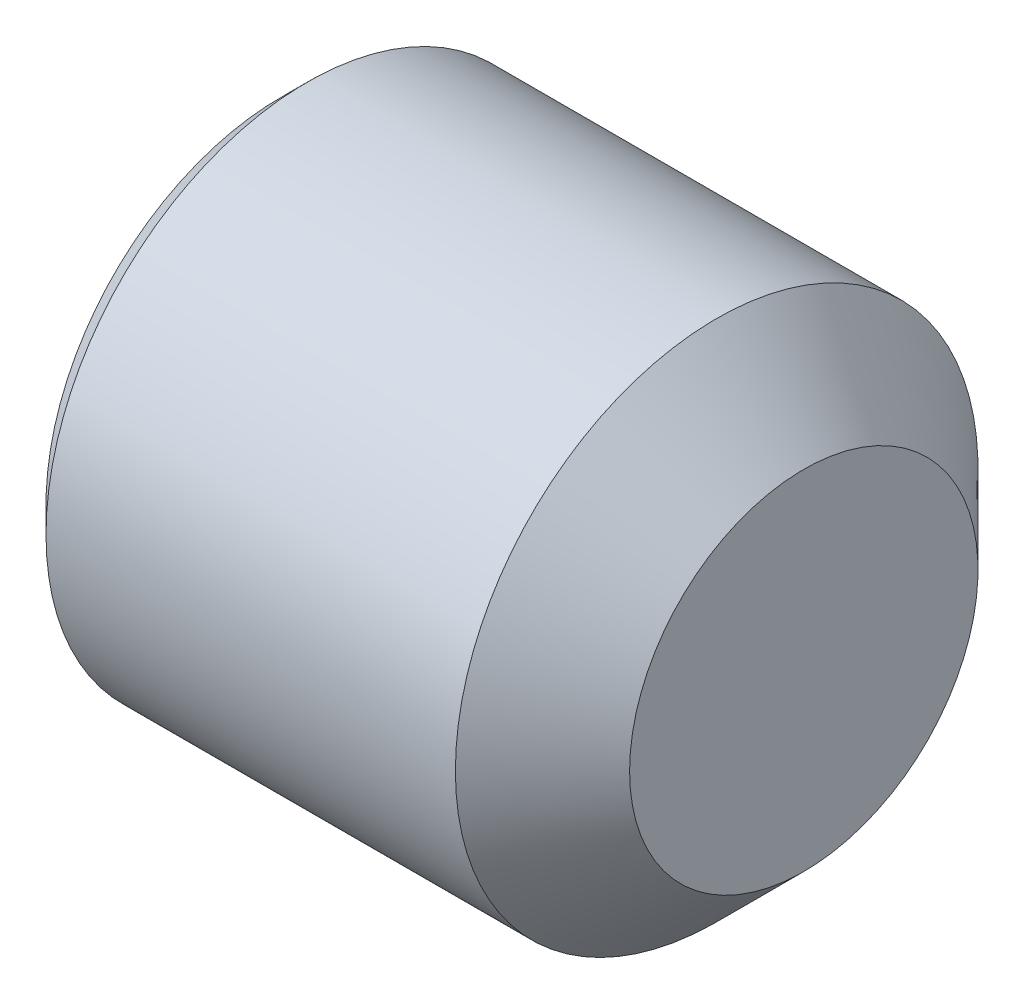
ISO-10303-21;
HEADER;
FILE_DESCRIPTION(('STEP AP214'),'2;1');
FILE_NAME('part.step','',(''),(''),'','','');
FILE_SCHEMA(('AUTOMOTIVE_DESIGN { 1 0 10303 214 1 1 1 1 }'));
ENDSEC;
DATA;
#1=APPLICATION_CONTEXT('core data for automotive mechanical design processes');
#2=APPLICATION_PROTOCOL_DEFINITION('international standard','automotive_design',2000,#1);
#3=PRODUCT_CONTEXT('',#1,'mechanical');
#4=PRODUCT('Part','Part','',(#3));
#5=PRODUCT_RELATED_PRODUCT_CATEGORY('part','',(#4));
#6=PRODUCT_DEFINITION_FORMATION('','',#4);
#7=PRODUCT_DEFINITION_CONTEXT('part definition',#1,'design');
#8=PRODUCT_DEFINITION('design','',#6,#7);
#9=PRODUCT_DEFINITION_SHAPE('','',#8);
#10=(LENGTH_UNIT() NAMED_UNIT(*) SI_UNIT(.MILLI.,.METRE.));
#11=(NAMED_UNIT(*) PLANE_ANGLE_UNIT() SI_UNIT($,.RADIAN.));
#12=(NAMED_UNIT(*) SI_UNIT($,.STERADIAN.) SOLID_ANGLE_UNIT());
#13=UNCERTAINTY_MEASURE_WITH_UNIT(LENGTH_MEASURE(1.E-05),#10,'distance_accuracy_value','');
#14=(GEOMETRIC_REPRESENTATION_CONTEXT(3) GLOBAL_UNCERTAINTY_ASSIGNED_CONTEXT((#13)) GLOBAL_UNIT_ASSIGNED_CONTEXT((#10,
#11,#12)) REPRESENTATION_CONTEXT('',''));
#15=CARTESIAN_POINT('',(0.,0.,0.));
#16=DIRECTION('',(0.,0.,1.));
#17=DIRECTION('',(1.,0.,0.));
#18=AXIS2_PLACEMENT_3D('',#15,#16,#17);
#19=CARTESIAN_POINT('',(2.,0.,0.));
#20=DIRECTION('',(1.,0.,0.));
#21=DIRECTION('',(0.,0.,-1.));
#22=AXIS2_PLACEMENT_3D('',#19,#20,#21);
#23=PLANE('',#22);
#24=CARTESIAN_POINT('',(2.,0.,0.));
#25=DIRECTION('',(-1.,0.,0.));
#26=DIRECTION('',(0.,-1.,0.));
#27=AXIS2_PLACEMENT_3D('',#24,#25,#26);
#28=CIRCLE('',#27,1.5);
#29=CARTESIAN_POINT('',(2.,-1.29903810567666,0.75));
#30=VERTEX_POINT('',#29);
#31=CARTESIAN_POINT('',(2.,0.,1.5));
#32=VERTEX_POINT('',#31);
#33=EDGE_CURVE('E54',#30,#32,#28,.T.);
#34=ORIENTED_EDGE('',*,*,#33,.F.);
#35=DIRECTION('',(0.,-0.5,-0.866025403784439));
#36=VECTOR('',#35,1.);
#37=CARTESIAN_POINT('',(2.,-0.866025403784438,1.5));
#38=LINE('',#37,#36);
#39=CARTESIAN_POINT('',(2.,-0.866025403784438,1.5));
#40=VERTEX_POINT('',#39);
#41=EDGE_CURVE('E169',#40,#30,#38,.T.);
#42=ORIENTED_EDGE('',*,*,#41,.F.);
#43=DIRECTION('',(0.,-1.,0.));
#44=VECTOR('',#43,1.);
#45=CARTESIAN_POINT('',(2.,0.866025403784439,1.5));
#46=LINE('',#45,#44);
#47=EDGE_CURVE('E373',#32,#40,#46,.T.);
#48=ORIENTED_EDGE('',*,*,#47,.F.);
#49=EDGE_LOOP('',(#34,#42,#48));
#50=FACE_BOUND('',#49,.T.);
#51=ADVANCED_FACE('F43',(#50),#23,.F.);
#52=CARTESIAN_POINT('',(2.,1.29903810567666,0.75));
#53=VERTEX_POINT('',#52);
#54=EDGE_CURVE('E11',#32,#53,#28,.T.);
#55=ORIENTED_EDGE('',*,*,#54,.F.);
#56=CARTESIAN_POINT('',(2.,0.866025403784439,1.5));
#57=VERTEX_POINT('',#56);
#58=EDGE_CURVE('E369',#57,#32,#46,.T.);
#59=ORIENTED_EDGE('',*,*,#58,.F.);
#60=DIRECTION('',(0.,-0.5,0.866025403784439));
#61=VECTOR('',#60,1.);
#62=CARTESIAN_POINT('',(2.,1.73205080756888,0.));
#63=LINE('',#62,#61);
#64=EDGE_CURVE('E366',#53,#57,#63,.T.);
#65=ORIENTED_EDGE('',*,*,#64,.F.);
#66=EDGE_LOOP('',(#55,#59,#65));
#67=FACE_BOUND('',#66,.T.);
#68=ADVANCED_FACE('F131',(#67),#23,.F.);
#69=CARTESIAN_POINT('',(2.,1.29903810567666,-0.75));
#70=VERTEX_POINT('',#69);
#71=EDGE_CURVE('E52',#53,#70,#28,.T.);
#72=ORIENTED_EDGE('',*,*,#71,.F.);
#73=CARTESIAN_POINT('',(2.,1.73205080756888,0.));
#74=VERTEX_POINT('',#73);
#75=EDGE_CURVE('E359',#74,#53,#63,.T.);
#76=ORIENTED_EDGE('',*,*,#75,.F.);
#77=DIRECTION('',(0.,0.5,0.866025403784439));
#78=VECTOR('',#77,1.);
#79=CARTESIAN_POINT('',(2.,0.866025403784439,-1.5));
#80=LINE('',#79,#78);
#81=EDGE_CURVE('E196',#70,#74,#80,.T.);
#82=ORIENTED_EDGE('',*,*,#81,.F.);
#83=EDGE_LOOP('',(#72,#76,#82));
#84=FACE_BOUND('',#83,.T.);
#85=ADVANCED_FACE('F138',(#84),#23,.F.);
#86=CARTESIAN_POINT('',(2.,0.,-1.5));
#87=VERTEX_POINT('',#86);
#88=EDGE_CURVE('E363',#70,#87,#28,.T.);
#89=ORIENTED_EDGE('',*,*,#88,.F.);
#90=CARTESIAN_POINT('',(2.,0.866025403784439,-1.5));
#91=VERTEX_POINT('',#90);
#92=EDGE_CURVE('E371',#91,#70,#80,.T.);
#93=ORIENTED_EDGE('',*,*,#92,.F.);
#94=DIRECTION('',(0.,1.,0.));
#95=VECTOR('',#94,1.);
#96=CARTESIAN_POINT('',(2.,-0.866025403784439,-1.5));
#97=LINE('',#96,#95);
#98=EDGE_CURVE('E174',#87,#91,#97,.T.);
#99=ORIENTED_EDGE('',*,*,#98,.F.);
#100=EDGE_LOOP('',(#89,#93,#99));
#101=FACE_BOUND('',#100,.T.);
#102=ADVANCED_FACE('F152',(#101),#23,.F.);
#103=CARTESIAN_POINT('',(2.,-1.29903810567666,-0.75));
#104=VERTEX_POINT('',#103);
#105=EDGE_CURVE('E61',#87,#104,#28,.T.);
#106=ORIENTED_EDGE('',*,*,#105,.F.);
#107=CARTESIAN_POINT('',(2.,-0.866025403784439,-1.5));
#108=VERTEX_POINT('',#107);
#109=EDGE_CURVE('E166',#108,#87,#97,.T.);
#110=ORIENTED_EDGE('',*,*,#109,.F.);
#111=DIRECTION('',(0.,0.5,-0.866025403784439));
#112=VECTOR('',#111,1.);
#113=CARTESIAN_POINT('',(2.,-1.73205080756888,0.));
#114=LINE('',#113,#112);
#115=EDGE_CURVE('E163',#104,#108,#114,.T.);
#116=ORIENTED_EDGE('',*,*,#115,.F.);
#117=EDGE_LOOP('',(#106,#110,#116));
#118=FACE_BOUND('',#117,.T.);
#119=ADVANCED_FACE('F143',(#118),#23,.F.);
#120=EDGE_CURVE('E156',#104,#30,#28,.T.);
#121=ORIENTED_EDGE('',*,*,#120,.F.);
#122=CARTESIAN_POINT('',(2.,-1.73205080756888,0.));
#123=VERTEX_POINT('',#122);
#124=EDGE_CURVE('E159',#123,#104,#114,.T.);
#125=ORIENTED_EDGE('',*,*,#124,.F.);
#126=EDGE_CURVE('E160',#30,#123,#38,.T.);
#127=ORIENTED_EDGE('',*,*,#126,.F.);
#128=EDGE_LOOP('',(#121,#125,#127));
#129=FACE_BOUND('',#128,.T.);
#130=ADVANCED_FACE('F133',(#129),#23,.F.);
#131=CARTESIAN_POINT('',(0.,0.,0.));
#132=DIRECTION('',(1.,0.,0.));
#133=DIRECTION('',(0.,0.,-1.));
#134=AXIS2_PLACEMENT_3D('',#131,#132,#133);
#135=PLANE('',#134);
#136=CARTESIAN_POINT('',(0.,0.,0.));
#137=DIRECTION('',(1.,0.,0.));
#138=DIRECTION('',(0.,0.,-1.));
#139=AXIS2_PLACEMENT_3D('',#136,#137,#138);
#140=CIRCLE('',#139,2.7);
#141=CARTESIAN_POINT('',(0.,0.,-2.7));
#142=VERTEX_POINT('',#141);
#143=EDGE_CURVE('E212',#142,#142,#140,.F.);
#144=ORIENTED_EDGE('',*,*,#143,.T.);
#145=EDGE_LOOP('',(#144));
#146=FACE_BOUND('',#145,.T.);
#147=DIRECTION('',(0.,0.5,0.866025403784439));
#148=VECTOR('',#147,1.);
#149=CARTESIAN_POINT('',(0.,0.866025403784439,-1.5));
#150=LINE('',#149,#148);
#151=CARTESIAN_POINT('',(0.,0.866025403784439,-1.5));
#152=VERTEX_POINT('',#151);
#153=CARTESIAN_POINT('',(0.,1.73205080756888,0.));
#154=VERTEX_POINT('',#153);
#155=EDGE_CURVE('E69',#152,#154,#150,.T.);
#156=ORIENTED_EDGE('',*,*,#155,.T.);
#157=DIRECTION('',(0.,-0.5,0.866025403784439));
#158=VECTOR('',#157,1.);
#159=CARTESIAN_POINT('',(0.,1.73205080756888,0.));
#160=LINE('',#159,#158);
#161=CARTESIAN_POINT('',(0.,0.866025403784439,1.5));
#162=VERTEX_POINT('',#161);
#163=EDGE_CURVE('E181',#154,#162,#160,.T.);
#164=ORIENTED_EDGE('',*,*,#163,.T.);
#165=DIRECTION('',(0.,-1.,0.));
#166=VECTOR('',#165,1.);
#167=CARTESIAN_POINT('',(0.,0.866025403784439,1.5));
#168=LINE('',#167,#166);
#169=CARTESIAN_POINT('',(0.,-0.866025403784438,1.5));
#170=VERTEX_POINT('',#169);
#171=EDGE_CURVE('E184',#162,#170,#168,.T.);
#172=ORIENTED_EDGE('',*,*,#171,.T.);
#173=DIRECTION('',(0.,-0.5,-0.866025403784439));
#174=VECTOR('',#173,1.);
#175=CARTESIAN_POINT('',(0.,-0.866025403784438,1.5));
#176=LINE('',#175,#174);
#177=CARTESIAN_POINT('',(0.,-1.73205080756888,0.));
#178=VERTEX_POINT('',#177);
#179=EDGE_CURVE('E187',#170,#178,#176,.T.);
#180=ORIENTED_EDGE('',*,*,#179,.T.);
#181=DIRECTION('',(0.,0.5,-0.866025403784439));
#182=VECTOR('',#181,1.);
#183=CARTESIAN_POINT('',(0.,-1.73205080756888,0.));
#184=LINE('',#183,#182);
#185=CARTESIAN_POINT('',(0.,-0.866025403784439,-1.5));
#186=VERTEX_POINT('',#185);
#187=EDGE_CURVE('E190',#178,#186,#184,.T.);
#188=ORIENTED_EDGE('',*,*,#187,.T.);
#189=DIRECTION('',(0.,1.,0.));
#190=VECTOR('',#189,1.);
#191=CARTESIAN_POINT('',(0.,-0.866025403784439,-1.5));
#192=LINE('',#191,#190);
#193=EDGE_CURVE('E193',#186,#152,#192,.T.);
#194=ORIENTED_EDGE('',*,*,#193,.T.);
#195=EDGE_LOOP('',(#156,#164,#172,#180,#188,#194));
#196=FACE_BOUND('',#195,.T.);
#197=ADVANCED_FACE('F142',(#146,#196),#135,.F.);
#198=CARTESIAN_POINT('',(6.,0.,0.));
#199=DIRECTION('',(-1.,0.,0.));
#200=DIRECTION('',(0.,0.,1.));
#201=AXIS2_PLACEMENT_3D('',#198,#199,#200);
#202=PLANE('',#201);
#203=CARTESIAN_POINT('',(6.,0.,0.));
#204=DIRECTION('',(-1.,0.,0.));
#205=DIRECTION('',(0.,0.,1.));
#206=AXIS2_PLACEMENT_3D('',#203,#204,#205);
#207=CIRCLE('',#206,2.);
#208=CARTESIAN_POINT('',(6.,0.,2.));
#209=VERTEX_POINT('',#208);
#210=EDGE_CURVE('E210',#209,#209,#207,.T.);
#211=ORIENTED_EDGE('',*,*,#210,.F.);
#212=EDGE_LOOP('',(#211));
#213=FACE_BOUND('',#212,.T.);
#214=ADVANCED_FACE('F149',(#213),#202,.F.);
#215=CARTESIAN_POINT('',(6.,0.,0.));
#216=DIRECTION('',(-1.,0.,0.));
#217=DIRECTION('',(0.,0.,1.));
#218=AXIS2_PLACEMENT_3D('',#215,#216,#217);
#219=CONICAL_SURFACE('',#218,2.,0.78539816339745);
#220=CARTESIAN_POINT('',(5.,0.,0.));
#221=DIRECTION('',(-1.,0.,0.));
#222=DIRECTION('',(0.,0.,1.));
#223=AXIS2_PLACEMENT_3D('',#220,#221,#222);
#224=CIRCLE('',#223,3.);
#225=CARTESIAN_POINT('',(5.,0.,3.));
#226=VERTEX_POINT('',#225);
#227=EDGE_CURVE('E207',#226,#226,#224,.T.);
#228=ORIENTED_EDGE('',*,*,#227,.F.);
#229=EDGE_LOOP('',(#228));
#230=FACE_BOUND('',#229,.T.);
#231=ORIENTED_EDGE('',*,*,#210,.T.);
#232=EDGE_LOOP('',(#231));
#233=FACE_BOUND('',#232,.T.);
#234=ADVANCED_FACE('F230',(#230,#233),#219,.T.);
#235=CARTESIAN_POINT('',(0.,0.,0.));
#236=DIRECTION('',(-1.,0.,0.));
#237=DIRECTION('',(0.,0.,1.));
#238=AXIS2_PLACEMENT_3D('',#235,#236,#237);
#239=CYLINDRICAL_SURFACE('',#238,3.);
#240=CARTESIAN_POINT('',(0.299999999999999,0.,0.));
#241=DIRECTION('',(1.,0.,0.));
#242=DIRECTION('',(0.,0.,-1.));
#243=AXIS2_PLACEMENT_3D('',#240,#241,#242);
#244=CIRCLE('',#243,3.);
#245=CARTESIAN_POINT('',(0.299999999999999,0.,-3.));
#246=VERTEX_POINT('',#245);
#247=EDGE_CURVE('E47',#246,#246,#244,.T.);
#248=ORIENTED_EDGE('',*,*,#247,.T.);
#249=EDGE_LOOP('',(#248));
#250=FACE_BOUND('',#249,.T.);
#251=ORIENTED_EDGE('',*,*,#227,.T.);
#252=EDGE_LOOP('',(#251));
#253=FACE_BOUND('',#252,.T.);
#254=ADVANCED_FACE('F218',(#250,#253),#239,.T.);
#255=CARTESIAN_POINT('',(0.,0.,0.));
#256=DIRECTION('',(1.,0.,0.));
#257=DIRECTION('',(0.,0.,-1.));
#258=AXIS2_PLACEMENT_3D('',#255,#256,#257);
#259=CONICAL_SURFACE('',#258,2.7,0.785398163397447);
#260=ORIENTED_EDGE('',*,*,#247,.F.);
#261=EDGE_LOOP('',(#260));
#262=FACE_BOUND('',#261,.T.);
#263=ORIENTED_EDGE('',*,*,#143,.F.);
#264=EDGE_LOOP('',(#263));
#265=FACE_BOUND('',#264,.T.);
#266=ADVANCED_FACE('F45',(#262,#265),#259,.T.);
#267=CARTESIAN_POINT('',(2.,0.866025403784439,-1.5));
#268=DIRECTION('',(0.,-0.866025403784439,0.5));
#269=DIRECTION('',(0.,-0.5,-0.866025403784439));
#270=AXIS2_PLACEMENT_3D('',#267,#268,#269);
#271=PLANE('',#270);
#272=ORIENTED_EDGE('',*,*,#155,.F.);
#273=DIRECTION('',(-1.,0.,0.));
#274=VECTOR('',#273,1.);
#275=CARTESIAN_POINT('',(2.,0.866025403784439,-1.5));
#276=LINE('',#275,#274);
#277=EDGE_CURVE('E179',#91,#152,#276,.T.);
#278=ORIENTED_EDGE('',*,*,#277,.F.);
#279=ORIENTED_EDGE('',*,*,#92,.T.);
#280=ORIENTED_EDGE('',*,*,#81,.T.);
#281=DIRECTION('',(-1.,0.,0.));
#282=VECTOR('',#281,1.);
#283=CARTESIAN_POINT('',(2.,1.73205080756888,0.));
#284=LINE('',#283,#282);
#285=EDGE_CURVE('E205',#74,#154,#284,.T.);
#286=ORIENTED_EDGE('',*,*,#285,.T.);
#287=EDGE_LOOP('',(#272,#278,#279,#280,#286));
#288=FACE_BOUND('',#287,.T.);
#289=ADVANCED_FACE('F223',(#288),#271,.T.);
#290=CARTESIAN_POINT('',(2.,1.73205080756888,0.));
#291=DIRECTION('',(0.,-0.866025403784439,-0.5));
#292=DIRECTION('',(0.,0.5,-0.866025403784439));
#293=AXIS2_PLACEMENT_3D('',#290,#291,#292);
#294=PLANE('',#293);
#295=ORIENTED_EDGE('',*,*,#163,.F.);
#296=ORIENTED_EDGE('',*,*,#285,.F.);
#297=ORIENTED_EDGE('',*,*,#75,.T.);
#298=ORIENTED_EDGE('',*,*,#64,.T.);
#299=DIRECTION('',(-1.,0.,0.));
#300=VECTOR('',#299,1.);
#301=CARTESIAN_POINT('',(2.,0.866025403784439,1.5));
#302=LINE('',#301,#300);
#303=EDGE_CURVE('E203',#57,#162,#302,.T.);
#304=ORIENTED_EDGE('',*,*,#303,.T.);
#305=EDGE_LOOP('',(#295,#296,#297,#298,#304));
#306=FACE_BOUND('',#305,.T.);
#307=ADVANCED_FACE('F227',(#306),#294,.T.);
#308=CARTESIAN_POINT('',(2.,0.866025403784439,1.5));
#309=DIRECTION('',(0.,0.,-1.));
#310=DIRECTION('',(-1.,0.,0.));
#311=AXIS2_PLACEMENT_3D('',#308,#309,#310);
#312=PLANE('',#311);
#313=ORIENTED_EDGE('',*,*,#171,.F.);
#314=ORIENTED_EDGE('',*,*,#303,.F.);
#315=ORIENTED_EDGE('',*,*,#58,.T.);
#316=ORIENTED_EDGE('',*,*,#47,.T.);
#317=DIRECTION('',(-1.,0.,0.));
#318=VECTOR('',#317,1.);
#319=CARTESIAN_POINT('',(2.,-0.866025403784438,1.5));
#320=LINE('',#319,#318);
#321=EDGE_CURVE('E201',#40,#170,#320,.T.);
#322=ORIENTED_EDGE('',*,*,#321,.T.);
#323=EDGE_LOOP('',(#313,#314,#315,#316,#322));
#324=FACE_BOUND('',#323,.T.);
#325=ADVANCED_FACE('F277',(#324),#312,.T.);
#326=CARTESIAN_POINT('',(2.,-0.866025403784438,1.5));
#327=DIRECTION('',(0.,0.866025403784439,-0.5));
#328=DIRECTION('',(0.,0.5,0.866025403784439));
#329=AXIS2_PLACEMENT_3D('',#326,#327,#328);
#330=PLANE('',#329);
#331=ORIENTED_EDGE('',*,*,#179,.F.);
#332=ORIENTED_EDGE('',*,*,#321,.F.);
#333=ORIENTED_EDGE('',*,*,#41,.T.);
#334=ORIENTED_EDGE('',*,*,#126,.T.);
#335=DIRECTION('',(-1.,0.,0.));
#336=VECTOR('',#335,1.);
#337=CARTESIAN_POINT('',(2.,-1.73205080756888,0.));
#338=LINE('',#337,#336);
#339=EDGE_CURVE('E173',#123,#178,#338,.T.);
#340=ORIENTED_EDGE('',*,*,#339,.T.);
#341=EDGE_LOOP('',(#331,#332,#333,#334,#340));
#342=FACE_BOUND('',#341,.T.);
#343=ADVANCED_FACE('F287',(#342),#330,.T.);
#344=CARTESIAN_POINT('',(2.,-1.73205080756888,0.));
#345=DIRECTION('',(0.,0.866025403784439,0.5));
#346=DIRECTION('',(0.,-0.5,0.866025403784439));
#347=AXIS2_PLACEMENT_3D('',#344,#345,#346);
#348=PLANE('',#347);
#349=ORIENTED_EDGE('',*,*,#187,.F.);
#350=ORIENTED_EDGE('',*,*,#339,.F.);
#351=ORIENTED_EDGE('',*,*,#124,.T.);
#352=ORIENTED_EDGE('',*,*,#115,.T.);
#353=DIRECTION('',(-1.,0.,0.));
#354=VECTOR('',#353,1.);
#355=CARTESIAN_POINT('',(2.,-0.866025403784439,-1.5));
#356=LINE('',#355,#354);
#357=EDGE_CURVE('E198',#108,#186,#356,.T.);
#358=ORIENTED_EDGE('',*,*,#357,.T.);
#359=EDGE_LOOP('',(#349,#350,#351,#352,#358));
#360=FACE_BOUND('',#359,.T.);
#361=ADVANCED_FACE('F126',(#360),#348,.T.);
#362=CARTESIAN_POINT('',(2.,-0.866025403784439,-1.5));
#363=DIRECTION('',(0.,0.,1.));
#364=DIRECTION('',(1.,0.,0.));
#365=AXIS2_PLACEMENT_3D('',#362,#363,#364);
#366=PLANE('',#365);
#367=ORIENTED_EDGE('',*,*,#193,.F.);
#368=ORIENTED_EDGE('',*,*,#357,.F.);
#369=ORIENTED_EDGE('',*,*,#109,.T.);
#370=ORIENTED_EDGE('',*,*,#98,.T.);
#371=ORIENTED_EDGE('',*,*,#277,.T.);
#372=EDGE_LOOP('',(#367,#368,#369,#370,#371));
#373=FACE_BOUND('',#372,.T.);
#374=ADVANCED_FACE('F121',(#373),#366,.T.);
#375=CARTESIAN_POINT('',(2.86602540378443,0.,0.));
#376=DIRECTION('',(-1.,0.,0.));
#377=DIRECTION('',(0.,-1.,0.));
#378=AXIS2_PLACEMENT_3D('',#375,#376,#377);
#379=CONICAL_SURFACE('',#378,0.,1.0471975511966);
#380=ORIENTED_EDGE('',*,*,#33,.T.);
#381=ORIENTED_EDGE('',*,*,#54,.T.);
#382=ORIENTED_EDGE('',*,*,#71,.T.);
#383=ORIENTED_EDGE('',*,*,#88,.T.);
#384=ORIENTED_EDGE('',*,*,#105,.T.);
#385=ORIENTED_EDGE('',*,*,#120,.T.);
#386=EDGE_LOOP('',(#380,#381,#382,#383,#384,#385));
#387=FACE_BOUND('',#386,.T.);
#388=CARTESIAN_POINT('',(2.86602540378443,0.,0.));
#389=VERTEX_POINT('',#388);
#390=VERTEX_LOOP('',#389);
#391=FACE_BOUND('',#390,.T.);
#392=ADVANCED_FACE('F119',(#387,#391),#379,.F.);
#393=CLOSED_SHELL('',(#51,#68,#85,#102,#119,#130,#197,#214,#234,#254,#266,#289,#307,#325,#343,
#361,#374,#392));
#394=MANIFOLD_SOLID_BREP('B2',#393);
#395=ADVANCED_BREP_SHAPE_REPRESENTATION('',(#18,#394),#14);
#396=SHAPE_DEFINITION_REPRESENTATION(#9,#395);
ENDSEC;
END-ISO-10303-21;
